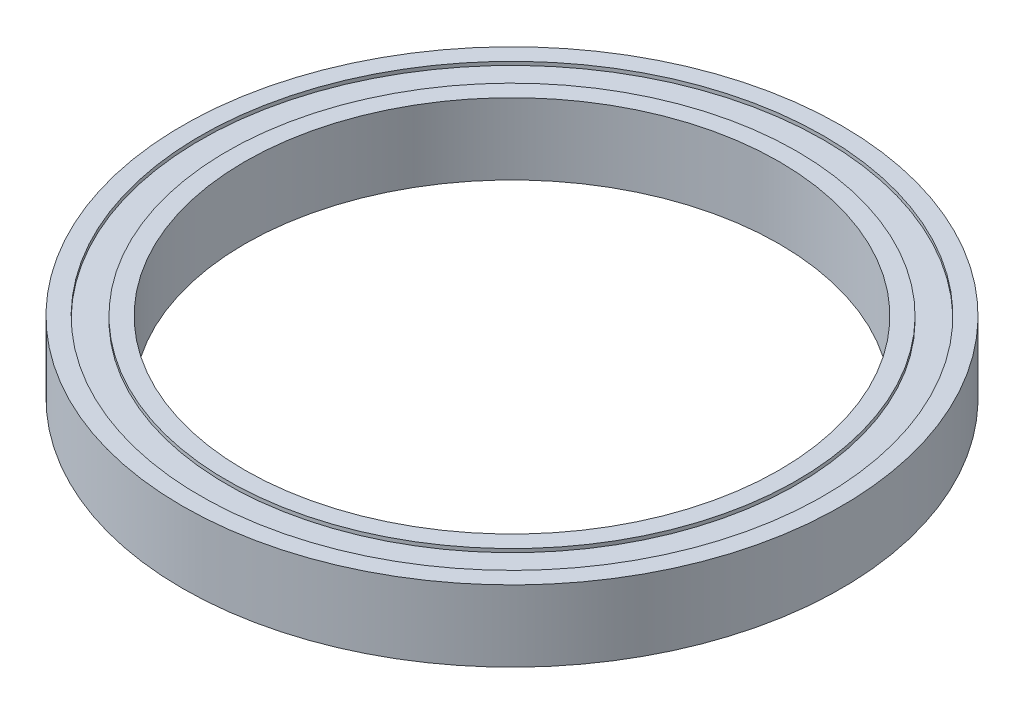
ISO-10303-21;
HEADER;
FILE_DESCRIPTION(('STEP AP214'),'2;1');
FILE_NAME('part.step','',(''),(''),'','','');
FILE_SCHEMA(('AUTOMOTIVE_DESIGN { 1 0 10303 214 1 1 1 1 }'));
ENDSEC;
DATA;
#1=APPLICATION_CONTEXT('core data for automotive mechanical design processes');
#2=APPLICATION_PROTOCOL_DEFINITION('international standard','automotive_design',2000,#1);
#3=PRODUCT_CONTEXT('',#1,'mechanical');
#4=PRODUCT('Part','Part','',(#3));
#5=PRODUCT_RELATED_PRODUCT_CATEGORY('part','',(#4));
#6=PRODUCT_DEFINITION_FORMATION('','',#4);
#7=PRODUCT_DEFINITION_CONTEXT('part definition',#1,'design');
#8=PRODUCT_DEFINITION('design','',#6,#7);
#9=PRODUCT_DEFINITION_SHAPE('','',#8);
#10=(LENGTH_UNIT() NAMED_UNIT(*) SI_UNIT(.MILLI.,.METRE.));
#11=(NAMED_UNIT(*) PLANE_ANGLE_UNIT() SI_UNIT($,.RADIAN.));
#12=(NAMED_UNIT(*) SI_UNIT($,.STERADIAN.) SOLID_ANGLE_UNIT());
#13=UNCERTAINTY_MEASURE_WITH_UNIT(LENGTH_MEASURE(1.E-05),#10,'distance_accuracy_value','');
#14=(GEOMETRIC_REPRESENTATION_CONTEXT(3) GLOBAL_UNCERTAINTY_ASSIGNED_CONTEXT((#13)) GLOBAL_UNIT_ASSIGNED_CONTEXT((#10,
#11,#12)) REPRESENTATION_CONTEXT('',''));
#15=CARTESIAN_POINT('',(0.,0.,0.));
#16=DIRECTION('',(0.,0.,1.));
#17=DIRECTION('',(1.,0.,0.));
#18=AXIS2_PLACEMENT_3D('',#15,#16,#17);
#19=CARTESIAN_POINT('',(0.,-2.,-17.500267461634));
#20=DIRECTION('',(0.,-1.,0.));
#21=DIRECTION('',(0.,0.,-1.));
#22=AXIS2_PLACEMENT_3D('',#19,#20,#21);
#23=PLANE('',#22);
#24=CARTESIAN_POINT('',(0.,-2.,0.));
#25=DIRECTION('',(0.,-1.,0.));
#26=DIRECTION('',(0.,0.,-1.));
#27=AXIS2_PLACEMENT_3D('',#24,#25,#26);
#28=CIRCLE('',#27,18.5);
#29=CARTESIAN_POINT('',(0.,-2.,-18.5));
#30=VERTEX_POINT('',#29);
#31=EDGE_CURVE('E74',#30,#30,#28,.T.);
#32=ORIENTED_EDGE('',*,*,#31,.T.);
#33=EDGE_LOOP('',(#32));
#34=FACE_BOUND('',#33,.T.);
#35=CARTESIAN_POINT('',(0.,-2.,0.));
#36=DIRECTION('',(0.,-1.,0.));
#37=DIRECTION('',(0.,0.,-1.));
#38=AXIS2_PLACEMENT_3D('',#35,#36,#37);
#39=CIRCLE('',#38,17.500267461634);
#40=CARTESIAN_POINT('',(0.,-2.,-17.500267461634));
#41=VERTEX_POINT('',#40);
#42=EDGE_CURVE('E10',#41,#41,#39,.T.);
#43=ORIENTED_EDGE('',*,*,#42,.F.);
#44=EDGE_LOOP('',(#43));
#45=FACE_BOUND('',#44,.T.);
#46=ADVANCED_FACE('F34',(#34,#45),#23,.T.);
#47=CARTESIAN_POINT('',(0.,-4.38038841265842,0.));
#48=DIRECTION('',(0.,-1.,0.));
#49=DIRECTION('',(0.,0.,-1.));
#50=AXIS2_PLACEMENT_3D('',#47,#48,#49);
#51=CYLINDRICAL_SURFACE('',#50,17.500267461634);
#52=ORIENTED_EDGE('',*,*,#42,.T.);
#53=EDGE_LOOP('',(#52));
#54=FACE_BOUND('',#53,.T.);
#55=CARTESIAN_POINT('',(0.,-1.8,0.));
#56=DIRECTION('',(0.,-1.,0.));
#57=DIRECTION('',(0.,0.,-1.));
#58=AXIS2_PLACEMENT_3D('',#55,#56,#57);
#59=CIRCLE('',#58,17.500267461634);
#60=CARTESIAN_POINT('',(0.,-1.8,-17.500267461634));
#61=VERTEX_POINT('',#60);
#62=EDGE_CURVE('E40',#61,#61,#59,.T.);
#63=ORIENTED_EDGE('',*,*,#62,.F.);
#64=EDGE_LOOP('',(#63));
#65=FACE_BOUND('',#64,.T.);
#66=ADVANCED_FACE('F92',(#54,#65),#51,.F.);
#67=CARTESIAN_POINT('',(0.,-1.8,-16.));
#68=DIRECTION('',(0.,-1.,0.));
#69=DIRECTION('',(0.,0.,-1.));
#70=AXIS2_PLACEMENT_3D('',#67,#68,#69);
#71=PLANE('',#70);
#72=ORIENTED_EDGE('',*,*,#62,.T.);
#73=EDGE_LOOP('',(#72));
#74=FACE_BOUND('',#73,.T.);
#75=CARTESIAN_POINT('',(0.,-1.8,0.));
#76=DIRECTION('',(0.,-1.,0.));
#77=DIRECTION('',(0.,0.,-1.));
#78=AXIS2_PLACEMENT_3D('',#75,#76,#77);
#79=CIRCLE('',#78,16.);
#80=CARTESIAN_POINT('',(0.,-1.8,-16.));
#81=VERTEX_POINT('',#80);
#82=EDGE_CURVE('E44',#81,#81,#79,.T.);
#83=ORIENTED_EDGE('',*,*,#82,.F.);
#84=EDGE_LOOP('',(#83));
#85=FACE_BOUND('',#84,.T.);
#86=ADVANCED_FACE('F96',(#74,#85),#71,.T.);
#87=CARTESIAN_POINT('',(0.,-4.38038841265842,0.));
#88=DIRECTION('',(0.,-1.,0.));
#89=DIRECTION('',(0.,0.,-1.));
#90=AXIS2_PLACEMENT_3D('',#87,#88,#89);
#91=CYLINDRICAL_SURFACE('',#90,16.);
#92=ORIENTED_EDGE('',*,*,#82,.T.);
#93=EDGE_LOOP('',(#92));
#94=FACE_BOUND('',#93,.T.);
#95=CARTESIAN_POINT('',(0.,-2.,0.));
#96=DIRECTION('',(0.,-1.,0.));
#97=DIRECTION('',(0.,0.,-1.));
#98=AXIS2_PLACEMENT_3D('',#95,#96,#97);
#99=CIRCLE('',#98,16.);
#100=CARTESIAN_POINT('',(0.,-2.,-16.));
#101=VERTEX_POINT('',#100);
#102=EDGE_CURVE('E48',#101,#101,#99,.T.);
#103=ORIENTED_EDGE('',*,*,#102,.F.);
#104=EDGE_LOOP('',(#103));
#105=FACE_BOUND('',#104,.T.);
#106=ADVANCED_FACE('F100',(#94,#105),#91,.T.);
#107=CARTESIAN_POINT('',(0.,-2.,-15.));
#108=DIRECTION('',(0.,-1.,0.));
#109=DIRECTION('',(0.,0.,-1.));
#110=AXIS2_PLACEMENT_3D('',#107,#108,#109);
#111=PLANE('',#110);
#112=ORIENTED_EDGE('',*,*,#102,.T.);
#113=EDGE_LOOP('',(#112));
#114=FACE_BOUND('',#113,.T.);
#115=CARTESIAN_POINT('',(0.,-2.,0.));
#116=DIRECTION('',(0.,-1.,0.));
#117=DIRECTION('',(0.,0.,-1.));
#118=AXIS2_PLACEMENT_3D('',#115,#116,#117);
#119=CIRCLE('',#118,15.);
#120=CARTESIAN_POINT('',(0.,-2.,-15.));
#121=VERTEX_POINT('',#120);
#122=EDGE_CURVE('E53',#121,#121,#119,.T.);
#123=ORIENTED_EDGE('',*,*,#122,.F.);
#124=EDGE_LOOP('',(#123));
#125=FACE_BOUND('',#124,.T.);
#126=ADVANCED_FACE('F106',(#114,#125),#111,.T.);
#127=CARTESIAN_POINT('',(0.,-4.38038841265842,0.));
#128=DIRECTION('',(0.,-1.,0.));
#129=DIRECTION('',(0.,0.,-1.));
#130=AXIS2_PLACEMENT_3D('',#127,#128,#129);
#131=CYLINDRICAL_SURFACE('',#130,15.);
#132=ORIENTED_EDGE('',*,*,#122,.T.);
#133=EDGE_LOOP('',(#132));
#134=FACE_BOUND('',#133,.T.);
#135=CARTESIAN_POINT('',(0.,2.,0.));
#136=DIRECTION('',(0.,-1.,0.));
#137=DIRECTION('',(0.,0.,-1.));
#138=AXIS2_PLACEMENT_3D('',#135,#136,#137);
#139=CIRCLE('',#138,15.);
#140=CARTESIAN_POINT('',(0.,2.,-15.));
#141=VERTEX_POINT('',#140);
#142=EDGE_CURVE('E56',#141,#141,#139,.T.);
#143=ORIENTED_EDGE('',*,*,#142,.F.);
#144=EDGE_LOOP('',(#143));
#145=FACE_BOUND('',#144,.T.);
#146=ADVANCED_FACE('F110',(#134,#145),#131,.F.);
#147=CARTESIAN_POINT('',(0.,2.,-15.));
#148=DIRECTION('',(0.,1.,0.));
#149=DIRECTION('',(0.,0.,1.));
#150=AXIS2_PLACEMENT_3D('',#147,#148,#149);
#151=PLANE('',#150);
#152=ORIENTED_EDGE('',*,*,#142,.T.);
#153=EDGE_LOOP('',(#152));
#154=FACE_BOUND('',#153,.T.);
#155=CARTESIAN_POINT('',(0.,2.,0.));
#156=DIRECTION('',(0.,-1.,0.));
#157=DIRECTION('',(0.,0.,-1.));
#158=AXIS2_PLACEMENT_3D('',#155,#156,#157);
#159=CIRCLE('',#158,16.);
#160=CARTESIAN_POINT('',(0.,2.,-16.));
#161=VERTEX_POINT('',#160);
#162=EDGE_CURVE('E59',#161,#161,#159,.T.);
#163=ORIENTED_EDGE('',*,*,#162,.F.);
#164=EDGE_LOOP('',(#163));
#165=FACE_BOUND('',#164,.T.);
#166=ADVANCED_FACE('F114',(#154,#165),#151,.T.);
#167=CARTESIAN_POINT('',(0.,-4.38038841265842,0.));
#168=DIRECTION('',(0.,-1.,0.));
#169=DIRECTION('',(0.,0.,-1.));
#170=AXIS2_PLACEMENT_3D('',#167,#168,#169);
#171=CYLINDRICAL_SURFACE('',#170,16.);
#172=ORIENTED_EDGE('',*,*,#162,.T.);
#173=EDGE_LOOP('',(#172));
#174=FACE_BOUND('',#173,.T.);
#175=CARTESIAN_POINT('',(0.,1.8,0.));
#176=DIRECTION('',(0.,-1.,0.));
#177=DIRECTION('',(0.,0.,-1.));
#178=AXIS2_PLACEMENT_3D('',#175,#176,#177);
#179=CIRCLE('',#178,16.);
#180=CARTESIAN_POINT('',(0.,1.8,-16.));
#181=VERTEX_POINT('',#180);
#182=EDGE_CURVE('E62',#181,#181,#179,.T.);
#183=ORIENTED_EDGE('',*,*,#182,.F.);
#184=EDGE_LOOP('',(#183));
#185=FACE_BOUND('',#184,.T.);
#186=ADVANCED_FACE('F118',(#174,#185),#171,.T.);
#187=CARTESIAN_POINT('',(0.,1.8,-16.));
#188=DIRECTION('',(0.,1.,0.));
#189=DIRECTION('',(0.,0.,1.));
#190=AXIS2_PLACEMENT_3D('',#187,#188,#189);
#191=PLANE('',#190);
#192=ORIENTED_EDGE('',*,*,#182,.T.);
#193=EDGE_LOOP('',(#192));
#194=FACE_BOUND('',#193,.T.);
#195=CARTESIAN_POINT('',(0.,1.8,0.));
#196=DIRECTION('',(0.,-1.,0.));
#197=DIRECTION('',(0.,0.,-1.));
#198=AXIS2_PLACEMENT_3D('',#195,#196,#197);
#199=CIRCLE('',#198,17.500267461634);
#200=CARTESIAN_POINT('',(0.,1.8,-17.500267461634));
#201=VERTEX_POINT('',#200);
#202=EDGE_CURVE('E65',#201,#201,#199,.T.);
#203=ORIENTED_EDGE('',*,*,#202,.F.);
#204=EDGE_LOOP('',(#203));
#205=FACE_BOUND('',#204,.T.);
#206=ADVANCED_FACE('F122',(#194,#205),#191,.T.);
#207=CARTESIAN_POINT('',(0.,-4.38038841265842,0.));
#208=DIRECTION('',(0.,-1.,0.));
#209=DIRECTION('',(0.,0.,-1.));
#210=AXIS2_PLACEMENT_3D('',#207,#208,#209);
#211=CYLINDRICAL_SURFACE('',#210,17.500267461634);
#212=ORIENTED_EDGE('',*,*,#202,.T.);
#213=EDGE_LOOP('',(#212));
#214=FACE_BOUND('',#213,.T.);
#215=CARTESIAN_POINT('',(0.,2.,0.));
#216=DIRECTION('',(0.,-1.,0.));
#217=DIRECTION('',(0.,0.,-1.));
#218=AXIS2_PLACEMENT_3D('',#215,#216,#217);
#219=CIRCLE('',#218,17.500267461634);
#220=CARTESIAN_POINT('',(0.,2.,-17.500267461634));
#221=VERTEX_POINT('',#220);
#222=EDGE_CURVE('E68',#221,#221,#219,.T.);
#223=ORIENTED_EDGE('',*,*,#222,.F.);
#224=EDGE_LOOP('',(#223));
#225=FACE_BOUND('',#224,.T.);
#226=ADVANCED_FACE('F88',(#214,#225),#211,.F.);
#227=CARTESIAN_POINT('',(0.,2.,-17.500267461634));
#228=DIRECTION('',(0.,1.,0.));
#229=DIRECTION('',(0.,0.,1.));
#230=AXIS2_PLACEMENT_3D('',#227,#228,#229);
#231=PLANE('',#230);
#232=ORIENTED_EDGE('',*,*,#222,.T.);
#233=EDGE_LOOP('',(#232));
#234=FACE_BOUND('',#233,.T.);
#235=CARTESIAN_POINT('',(0.,2.,0.));
#236=DIRECTION('',(0.,-1.,0.));
#237=DIRECTION('',(0.,0.,-1.));
#238=AXIS2_PLACEMENT_3D('',#235,#236,#237);
#239=CIRCLE('',#238,18.5);
#240=CARTESIAN_POINT('',(0.,2.,-18.5));
#241=VERTEX_POINT('',#240);
#242=EDGE_CURVE('E71',#241,#241,#239,.T.);
#243=ORIENTED_EDGE('',*,*,#242,.F.);
#244=EDGE_LOOP('',(#243));
#245=FACE_BOUND('',#244,.T.);
#246=ADVANCED_FACE('F82',(#234,#245),#231,.T.);
#247=CARTESIAN_POINT('',(0.,-4.38038841265842,0.));
#248=DIRECTION('',(0.,-1.,0.));
#249=DIRECTION('',(0.,0.,-1.));
#250=AXIS2_PLACEMENT_3D('',#247,#248,#249);
#251=CYLINDRICAL_SURFACE('',#250,18.5);
#252=ORIENTED_EDGE('',*,*,#242,.T.);
#253=EDGE_LOOP('',(#252));
#254=FACE_BOUND('',#253,.T.);
#255=ORIENTED_EDGE('',*,*,#31,.F.);
#256=EDGE_LOOP('',(#255));
#257=FACE_BOUND('',#256,.T.);
#258=ADVANCED_FACE('F80',(#254,#257),#251,.T.);
#259=CLOSED_SHELL('',(#46,#66,#86,#106,#126,#146,#166,#186,#206,#226,#246,#258));
#260=MANIFOLD_SOLID_BREP('B2',#259);
#261=ADVANCED_BREP_SHAPE_REPRESENTATION('',(#18,#260),#14);
#262=SHAPE_DEFINITION_REPRESENTATION(#9,#261);
ENDSEC;
END-ISO-10303-21;
